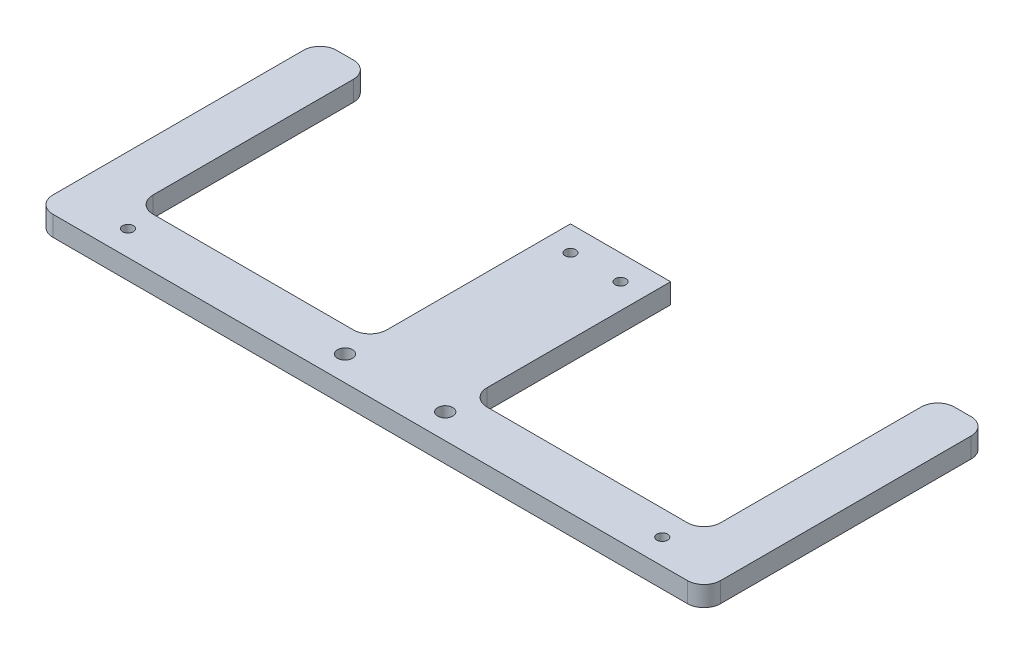
ISO-10303-21;
HEADER;
FILE_DESCRIPTION(('STEP AP214'),'2;1');
FILE_NAME('part.step','',(''),(''),'','','');
FILE_SCHEMA(('AUTOMOTIVE_DESIGN { 1 0 10303 214 1 1 1 1 }'));
ENDSEC;
DATA;
#1=APPLICATION_CONTEXT('core data for automotive mechanical design processes');
#2=APPLICATION_PROTOCOL_DEFINITION('international standard','automotive_design',2000,#1);
#3=PRODUCT_CONTEXT('',#1,'mechanical');
#4=PRODUCT('Part','Part','',(#3));
#5=PRODUCT_RELATED_PRODUCT_CATEGORY('part','',(#4));
#6=PRODUCT_DEFINITION_FORMATION('','',#4);
#7=PRODUCT_DEFINITION_CONTEXT('part definition',#1,'design');
#8=PRODUCT_DEFINITION('design','',#6,#7);
#9=PRODUCT_DEFINITION_SHAPE('','',#8);
#10=(LENGTH_UNIT() NAMED_UNIT(*) SI_UNIT(.MILLI.,.METRE.));
#11=(NAMED_UNIT(*) PLANE_ANGLE_UNIT() SI_UNIT($,.RADIAN.));
#12=(NAMED_UNIT(*) SI_UNIT($,.STERADIAN.) SOLID_ANGLE_UNIT());
#13=UNCERTAINTY_MEASURE_WITH_UNIT(LENGTH_MEASURE(1.E-05),#10,'distance_accuracy_value','');
#14=(GEOMETRIC_REPRESENTATION_CONTEXT(3) GLOBAL_UNCERTAINTY_ASSIGNED_CONTEXT((#13)) GLOBAL_UNIT_ASSIGNED_CONTEXT((#10,
#11,#12)) REPRESENTATION_CONTEXT('',''));
#15=CARTESIAN_POINT('',(0.,0.,0.));
#16=DIRECTION('',(0.,0.,1.));
#17=DIRECTION('',(1.,0.,0.));
#18=AXIS2_PLACEMENT_3D('',#15,#16,#17);
#19=CARTESIAN_POINT('',(-15.,6.,-60.));
#20=DIRECTION('',(0.,0.,1.));
#21=DIRECTION('',(1.,0.,0.));
#22=AXIS2_PLACEMENT_3D('',#19,#20,#21);
#23=PLANE('',#22);
#24=DIRECTION('',(-1.,0.,0.));
#25=VECTOR('',#24,1.);
#26=CARTESIAN_POINT('',(-15.,0.,-60.));
#27=LINE('',#26,#25);
#28=CARTESIAN_POINT('',(15.,0.,-60.));
#29=VERTEX_POINT('',#28);
#30=CARTESIAN_POINT('',(-15.,0.,-60.));
#31=VERTEX_POINT('',#30);
#32=EDGE_CURVE('E247',#29,#31,#27,.T.);
#33=ORIENTED_EDGE('',*,*,#32,.T.);
#34=DIRECTION('',(0.,-1.,0.));
#35=VECTOR('',#34,1.);
#36=CARTESIAN_POINT('',(-15.,6.,-60.));
#37=LINE('',#36,#35);
#38=CARTESIAN_POINT('',(-15.,6.,-60.));
#39=VERTEX_POINT('',#38);
#40=EDGE_CURVE('E188',#39,#31,#37,.T.);
#41=ORIENTED_EDGE('',*,*,#40,.F.);
#42=DIRECTION('',(-1.,0.,0.));
#43=VECTOR('',#42,1.);
#44=CARTESIAN_POINT('',(-15.,6.,-60.));
#45=LINE('',#44,#43);
#46=CARTESIAN_POINT('',(15.,6.,-60.));
#47=VERTEX_POINT('',#46);
#48=EDGE_CURVE('E183',#47,#39,#45,.T.);
#49=ORIENTED_EDGE('',*,*,#48,.F.);
#50=DIRECTION('',(0.,-1.,0.));
#51=VECTOR('',#50,1.);
#52=CARTESIAN_POINT('',(15.,6.,-60.));
#53=LINE('',#52,#51);
#54=EDGE_CURVE('E185',#47,#29,#53,.T.);
#55=ORIENTED_EDGE('',*,*,#54,.T.);
#56=EDGE_LOOP('',(#33,#41,#49,#55));
#57=FACE_BOUND('',#56,.T.);
#58=ADVANCED_FACE('F33',(#57),#23,.F.);
#59=CARTESIAN_POINT('',(-15.,6.,0.));
#60=DIRECTION('',(1.,0.,0.));
#61=DIRECTION('',(0.,0.,-1.));
#62=AXIS2_PLACEMENT_3D('',#59,#60,#61);
#63=PLANE('',#62);
#64=DIRECTION('',(0.,0.,1.));
#65=VECTOR('',#64,1.);
#66=CARTESIAN_POINT('',(-15.,0.,0.));
#67=LINE('',#66,#65);
#68=CARTESIAN_POINT('',(-15.,0.,-5.));
#69=VERTEX_POINT('',#68);
#70=EDGE_CURVE('E266',#31,#69,#67,.T.);
#71=ORIENTED_EDGE('',*,*,#70,.T.);
#72=DIRECTION('',(0.,-1.,0.));
#73=VECTOR('',#72,1.);
#74=CARTESIAN_POINT('',(-15.,6.,-5.));
#75=LINE('',#74,#73);
#76=CARTESIAN_POINT('',(-15.,6.,-5.));
#77=VERTEX_POINT('',#76);
#78=EDGE_CURVE('E289',#69,#77,#75,.F.);
#79=ORIENTED_EDGE('',*,*,#78,.T.);
#80=DIRECTION('',(0.,0.,1.));
#81=VECTOR('',#80,1.);
#82=CARTESIAN_POINT('',(-15.,6.,0.));
#83=LINE('',#82,#81);
#84=EDGE_CURVE('E192',#39,#77,#83,.T.);
#85=ORIENTED_EDGE('',*,*,#84,.F.);
#86=ORIENTED_EDGE('',*,*,#40,.T.);
#87=EDGE_LOOP('',(#71,#79,#85,#86));
#88=FACE_BOUND('',#87,.T.);
#89=ADVANCED_FACE('F386',(#88),#63,.F.);
#90=CARTESIAN_POINT('',(-85.,6.,0.));
#91=DIRECTION('',(0.,0.,1.));
#92=DIRECTION('',(1.,0.,0.));
#93=AXIS2_PLACEMENT_3D('',#90,#91,#92);
#94=PLANE('',#93);
#95=DIRECTION('',(-1.,0.,0.));
#96=VECTOR('',#95,1.);
#97=CARTESIAN_POINT('',(-85.,6.,0.));
#98=LINE('',#97,#96);
#99=CARTESIAN_POINT('',(-20.,6.,0.));
#100=VERTEX_POINT('',#99);
#101=CARTESIAN_POINT('',(-80.,6.,0.));
#102=VERTEX_POINT('',#101);
#103=EDGE_CURVE('E251',#100,#102,#98,.T.);
#104=ORIENTED_EDGE('',*,*,#103,.F.);
#105=DIRECTION('',(0.,-1.,0.));
#106=VECTOR('',#105,1.);
#107=CARTESIAN_POINT('',(-20.,0.,0.));
#108=LINE('',#107,#106);
#109=CARTESIAN_POINT('',(-20.,0.,0.));
#110=VERTEX_POINT('',#109);
#111=EDGE_CURVE('E286',#100,#110,#108,.T.);
#112=ORIENTED_EDGE('',*,*,#111,.T.);
#113=DIRECTION('',(-1.,0.,0.));
#114=VECTOR('',#113,1.);
#115=CARTESIAN_POINT('',(-85.,0.,0.));
#116=LINE('',#115,#114);
#117=CARTESIAN_POINT('',(-80.,0.,0.));
#118=VERTEX_POINT('',#117);
#119=EDGE_CURVE('E269',#110,#118,#116,.T.);
#120=ORIENTED_EDGE('',*,*,#119,.T.);
#121=DIRECTION('',(0.,-1.,0.));
#122=VECTOR('',#121,1.);
#123=CARTESIAN_POINT('',(-80.,6.,0.));
#124=LINE('',#123,#122);
#125=EDGE_CURVE('E284',#118,#102,#124,.F.);
#126=ORIENTED_EDGE('',*,*,#125,.T.);
#127=EDGE_LOOP('',(#104,#112,#120,#126));
#128=FACE_BOUND('',#127,.T.);
#129=ADVANCED_FACE('F395',(#128),#94,.F.);
#130=CARTESIAN_POINT('',(-85.,6.,0.));
#131=DIRECTION('',(-1.,0.,0.));
#132=DIRECTION('',(0.,0.,1.));
#133=AXIS2_PLACEMENT_3D('',#130,#131,#132);
#134=PLANE('',#133);
#135=DIRECTION('',(0.,0.,-1.));
#136=VECTOR('',#135,1.);
#137=CARTESIAN_POINT('',(-85.,6.,0.));
#138=LINE('',#137,#136);
#139=CARTESIAN_POINT('',(-85.,6.,-4.99999999999999));
#140=VERTEX_POINT('',#139);
#141=CARTESIAN_POINT('',(-85.,6.,-65.));
#142=VERTEX_POINT('',#141);
#143=EDGE_CURVE('E254',#140,#142,#138,.T.);
#144=ORIENTED_EDGE('',*,*,#143,.F.);
#145=DIRECTION('',(0.,-1.,0.));
#146=VECTOR('',#145,1.);
#147=CARTESIAN_POINT('',(-85.,0.,-4.99999999999999));
#148=LINE('',#147,#146);
#149=CARTESIAN_POINT('',(-85.,0.,-4.99999999999999));
#150=VERTEX_POINT('',#149);
#151=EDGE_CURVE('E293',#140,#150,#148,.T.);
#152=ORIENTED_EDGE('',*,*,#151,.T.);
#153=DIRECTION('',(0.,0.,-1.));
#154=VECTOR('',#153,1.);
#155=CARTESIAN_POINT('',(-85.,0.,0.));
#156=LINE('',#155,#154);
#157=CARTESIAN_POINT('',(-85.,0.,-65.));
#158=VERTEX_POINT('',#157);
#159=EDGE_CURVE('E272',#150,#158,#156,.T.);
#160=ORIENTED_EDGE('',*,*,#159,.T.);
#161=DIRECTION('',(0.,-1.,0.));
#162=VECTOR('',#161,1.);
#163=CARTESIAN_POINT('',(-85.,6.,-65.));
#164=LINE('',#163,#162);
#165=EDGE_CURVE('E291',#158,#142,#164,.F.);
#166=ORIENTED_EDGE('',*,*,#165,.T.);
#167=EDGE_LOOP('',(#144,#152,#160,#166));
#168=FACE_BOUND('',#167,.T.);
#169=ADVANCED_FACE('F404',(#168),#134,.F.);
#170=CARTESIAN_POINT('',(-85.,6.,-70.));
#171=DIRECTION('',(0.,0.,1.));
#172=DIRECTION('',(1.,0.,0.));
#173=AXIS2_PLACEMENT_3D('',#170,#171,#172);
#174=PLANE('',#173);
#175=DIRECTION('',(-1.,0.,0.));
#176=VECTOR('',#175,1.);
#177=CARTESIAN_POINT('',(-85.,0.,-70.));
#178=LINE('',#177,#176);
#179=CARTESIAN_POINT('',(-90.,0.,-70.));
#180=VERTEX_POINT('',#179);
#181=CARTESIAN_POINT('',(-95.,0.,-70.));
#182=VERTEX_POINT('',#181);
#183=EDGE_CURVE('E275',#180,#182,#178,.T.);
#184=ORIENTED_EDGE('',*,*,#183,.T.);
#185=DIRECTION('',(0.,-1.,0.));
#186=VECTOR('',#185,1.);
#187=CARTESIAN_POINT('',(-95.,6.,-70.));
#188=LINE('',#187,#186);
#189=CARTESIAN_POINT('',(-95.,6.,-70.));
#190=VERTEX_POINT('',#189);
#191=EDGE_CURVE('E319',#182,#190,#188,.F.);
#192=ORIENTED_EDGE('',*,*,#191,.T.);
#193=DIRECTION('',(-1.,0.,0.));
#194=VECTOR('',#193,1.);
#195=CARTESIAN_POINT('',(-85.,6.,-70.));
#196=LINE('',#195,#194);
#197=CARTESIAN_POINT('',(-90.,6.,-70.));
#198=VERTEX_POINT('',#197);
#199=EDGE_CURVE('E257',#198,#190,#196,.T.);
#200=ORIENTED_EDGE('',*,*,#199,.F.);
#201=DIRECTION('',(0.,-1.,0.));
#202=VECTOR('',#201,1.);
#203=CARTESIAN_POINT('',(-90.,6.,-70.));
#204=LINE('',#203,#202);
#205=EDGE_CURVE('E316',#198,#180,#204,.T.);
#206=ORIENTED_EDGE('',*,*,#205,.T.);
#207=EDGE_LOOP('',(#184,#192,#200,#206));
#208=FACE_BOUND('',#207,.T.);
#209=ADVANCED_FACE('F413',(#208),#174,.F.);
#210=CARTESIAN_POINT('',(-100.,6.,-70.));
#211=DIRECTION('',(1.,0.,0.));
#212=DIRECTION('',(0.,0.,-1.));
#213=AXIS2_PLACEMENT_3D('',#210,#211,#212);
#214=PLANE('',#213);
#215=DIRECTION('',(0.,0.,1.));
#216=VECTOR('',#215,1.);
#217=CARTESIAN_POINT('',(-100.,0.,-70.));
#218=LINE('',#217,#216);
#219=CARTESIAN_POINT('',(-100.,0.,-65.));
#220=VERTEX_POINT('',#219);
#221=CARTESIAN_POINT('',(-100.,0.,9.99999999999999));
#222=VERTEX_POINT('',#221);
#223=EDGE_CURVE('E278',#220,#222,#218,.T.);
#224=ORIENTED_EDGE('',*,*,#223,.T.);
#225=DIRECTION('',(0.,-1.,0.));
#226=VECTOR('',#225,1.);
#227=CARTESIAN_POINT('',(-100.,6.,9.99999999999999));
#228=LINE('',#227,#226);
#229=CARTESIAN_POINT('',(-100.,6.,9.99999999999999));
#230=VERTEX_POINT('',#229);
#231=EDGE_CURVE('E308',#222,#230,#228,.F.);
#232=ORIENTED_EDGE('',*,*,#231,.T.);
#233=DIRECTION('',(0.,0.,1.));
#234=VECTOR('',#233,1.);
#235=CARTESIAN_POINT('',(-100.,6.,-70.));
#236=LINE('',#235,#234);
#237=CARTESIAN_POINT('',(-100.,6.,-65.));
#238=VERTEX_POINT('',#237);
#239=EDGE_CURVE('E260',#238,#230,#236,.T.);
#240=ORIENTED_EDGE('',*,*,#239,.F.);
#241=DIRECTION('',(0.,-1.,0.));
#242=VECTOR('',#241,1.);
#243=CARTESIAN_POINT('',(-100.,6.,-65.));
#244=LINE('',#243,#242);
#245=EDGE_CURVE('E305',#238,#220,#244,.T.);
#246=ORIENTED_EDGE('',*,*,#245,.T.);
#247=EDGE_LOOP('',(#224,#232,#240,#246));
#248=FACE_BOUND('',#247,.T.);
#249=ADVANCED_FACE('F422',(#248),#214,.F.);
#250=CARTESIAN_POINT('',(-100.,6.,15.));
#251=DIRECTION('',(0.,0.,-1.));
#252=DIRECTION('',(-1.,0.,0.));
#253=AXIS2_PLACEMENT_3D('',#250,#251,#252);
#254=PLANE('',#253);
#255=DIRECTION('',(1.,0.,0.));
#256=VECTOR('',#255,1.);
#257=CARTESIAN_POINT('',(-100.,0.,15.));
#258=LINE('',#257,#256);
#259=CARTESIAN_POINT('',(-95.,0.,15.));
#260=VERTEX_POINT('',#259);
#261=CARTESIAN_POINT('',(95.,0.,15.));
#262=VERTEX_POINT('',#261);
#263=EDGE_CURVE('E193',#260,#262,#258,.T.);
#264=ORIENTED_EDGE('',*,*,#263,.T.);
#265=DIRECTION('',(0.,-1.,0.));
#266=VECTOR('',#265,1.);
#267=CARTESIAN_POINT('',(95.,6.,15.));
#268=LINE('',#267,#266);
#269=CARTESIAN_POINT('',(95.,6.,15.));
#270=VERTEX_POINT('',#269);
#271=EDGE_CURVE('E352',#262,#270,#268,.F.);
#272=ORIENTED_EDGE('',*,*,#271,.T.);
#273=DIRECTION('',(1.,0.,0.));
#274=VECTOR('',#273,1.);
#275=CARTESIAN_POINT('',(-100.,6.,15.));
#276=LINE('',#275,#274);
#277=CARTESIAN_POINT('',(-95.,6.,15.));
#278=VERTEX_POINT('',#277);
#279=EDGE_CURVE('E263',#278,#270,#276,.T.);
#280=ORIENTED_EDGE('',*,*,#279,.F.);
#281=DIRECTION('',(0.,-1.,0.));
#282=VECTOR('',#281,1.);
#283=CARTESIAN_POINT('',(-95.,6.,15.));
#284=LINE('',#283,#282);
#285=EDGE_CURVE('E296',#278,#260,#284,.T.);
#286=ORIENTED_EDGE('',*,*,#285,.T.);
#287=EDGE_LOOP('',(#264,#272,#280,#286));
#288=FACE_BOUND('',#287,.T.);
#289=ADVANCED_FACE('F431',(#288),#254,.F.);
#290=CARTESIAN_POINT('',(0.,6.,0.));
#291=DIRECTION('',(0.,1.,0.));
#292=DIRECTION('',(0.,0.,1.));
#293=AXIS2_PLACEMENT_3D('',#290,#291,#292);
#294=PLANE('',#293);
#295=CARTESIAN_POINT('',(7.5,6.,-52.5));
#296=DIRECTION('',(0.,-1.,0.));
#297=DIRECTION('',(0.,0.,1.));
#298=AXIS2_PLACEMENT_3D('',#295,#296,#297);
#299=CIRCLE('',#298,1.6);
#300=CARTESIAN_POINT('',(7.5,6.,-50.9));
#301=VERTEX_POINT('',#300);
#302=EDGE_CURVE('E746',#301,#301,#299,.T.);
#303=ORIENTED_EDGE('',*,*,#302,.T.);
#304=EDGE_LOOP('',(#303));
#305=FACE_BOUND('',#304,.T.);
#306=CARTESIAN_POINT('',(80.,6.,7.5));
#307=DIRECTION('',(0.,-1.,0.));
#308=DIRECTION('',(0.,0.,1.));
#309=AXIS2_PLACEMENT_3D('',#306,#307,#308);
#310=CIRCLE('',#309,1.60000000000001);
#311=CARTESIAN_POINT('',(80.,6.,9.1));
#312=VERTEX_POINT('',#311);
#313=EDGE_CURVE('E750',#312,#312,#310,.T.);
#314=ORIENTED_EDGE('',*,*,#313,.T.);
#315=EDGE_LOOP('',(#314));
#316=FACE_BOUND('',#315,.T.);
#317=CARTESIAN_POINT('',(15.,6.,7.5));
#318=DIRECTION('',(0.,-1.,0.));
#319=DIRECTION('',(0.,0.,1.));
#320=AXIS2_PLACEMENT_3D('',#317,#318,#319);
#321=CIRCLE('',#320,2.25);
#322=CARTESIAN_POINT('',(15.,6.,9.74999999999999));
#323=VERTEX_POINT('',#322);
#324=EDGE_CURVE('E446',#323,#323,#321,.T.);
#325=ORIENTED_EDGE('',*,*,#324,.T.);
#326=EDGE_LOOP('',(#325));
#327=FACE_BOUND('',#326,.T.);
#328=CARTESIAN_POINT('',(-7.5,6.,-52.5));
#329=DIRECTION('',(0.,1.,0.));
#330=DIRECTION('',(0.,0.,1.));
#331=AXIS2_PLACEMENT_3D('',#328,#329,#330);
#332=CIRCLE('',#331,1.6);
#333=CARTESIAN_POINT('',(-7.5,6.,-50.9));
#334=VERTEX_POINT('',#333);
#335=EDGE_CURVE('E203',#334,#334,#332,.T.);
#336=ORIENTED_EDGE('',*,*,#335,.F.);
#337=EDGE_LOOP('',(#336));
#338=FACE_BOUND('',#337,.T.);
#339=CARTESIAN_POINT('',(-80.,6.,7.5));
#340=DIRECTION('',(0.,1.,0.));
#341=DIRECTION('',(0.,0.,1.));
#342=AXIS2_PLACEMENT_3D('',#339,#340,#341);
#343=CIRCLE('',#342,1.60000000000001);
#344=CARTESIAN_POINT('',(-80.,6.,9.1));
#345=VERTEX_POINT('',#344);
#346=EDGE_CURVE('E236',#345,#345,#343,.T.);
#347=ORIENTED_EDGE('',*,*,#346,.F.);
#348=EDGE_LOOP('',(#347));
#349=FACE_BOUND('',#348,.T.);
#350=CARTESIAN_POINT('',(-15.,6.,7.5));
#351=DIRECTION('',(0.,1.,0.));
#352=DIRECTION('',(0.,0.,1.));
#353=AXIS2_PLACEMENT_3D('',#350,#351,#352);
#354=CIRCLE('',#353,2.25);
#355=CARTESIAN_POINT('',(-15.,6.,9.74999999999999));
#356=VERTEX_POINT('',#355);
#357=EDGE_CURVE('E235',#356,#356,#354,.T.);
#358=ORIENTED_EDGE('',*,*,#357,.F.);
#359=EDGE_LOOP('',(#358));
#360=FACE_BOUND('',#359,.T.);
#361=ORIENTED_EDGE('',*,*,#279,.T.);
#362=CARTESIAN_POINT('',(95.,6.,9.99999999999999));
#363=DIRECTION('',(0.,1.,0.));
#364=DIRECTION('',(0.,0.,1.));
#365=AXIS2_PLACEMENT_3D('',#362,#363,#364);
#366=CIRCLE('',#365,5.);
#367=CARTESIAN_POINT('',(100.,6.,9.99999999999999));
#368=VERTEX_POINT('',#367);
#369=EDGE_CURVE('E357',#270,#368,#366,.T.);
#370=ORIENTED_EDGE('',*,*,#369,.T.);
#371=DIRECTION('',(0.,0.,1.));
#372=VECTOR('',#371,1.);
#373=CARTESIAN_POINT('',(100.,6.,-70.));
#374=LINE('',#373,#372);
#375=CARTESIAN_POINT('',(100.,6.,-65.));
#376=VERTEX_POINT('',#375);
#377=EDGE_CURVE('E230',#376,#368,#374,.T.);
#378=ORIENTED_EDGE('',*,*,#377,.F.);
#379=CARTESIAN_POINT('',(95.,6.,-65.));
#380=DIRECTION('',(0.,1.,0.));
#381=DIRECTION('',(0.,0.,1.));
#382=AXIS2_PLACEMENT_3D('',#379,#380,#381);
#383=CIRCLE('',#382,5.);
#384=CARTESIAN_POINT('',(95.,6.,-70.));
#385=VERTEX_POINT('',#384);
#386=EDGE_CURVE('E48',#376,#385,#383,.T.);
#387=ORIENTED_EDGE('',*,*,#386,.T.);
#388=DIRECTION('',(1.,0.,0.));
#389=VECTOR('',#388,1.);
#390=CARTESIAN_POINT('',(85.,6.,-70.));
#391=LINE('',#390,#389);
#392=CARTESIAN_POINT('',(90.,6.,-70.));
#393=VERTEX_POINT('',#392);
#394=EDGE_CURVE('E442',#393,#385,#391,.T.);
#395=ORIENTED_EDGE('',*,*,#394,.F.);
#396=CARTESIAN_POINT('',(90.,6.,-65.));
#397=DIRECTION('',(0.,1.,0.));
#398=DIRECTION('',(0.,0.,1.));
#399=AXIS2_PLACEMENT_3D('',#396,#397,#398);
#400=CIRCLE('',#399,5.);
#401=CARTESIAN_POINT('',(85.,6.,-65.));
#402=VERTEX_POINT('',#401);
#403=EDGE_CURVE('E354',#393,#402,#400,.T.);
#404=ORIENTED_EDGE('',*,*,#403,.T.);
#405=DIRECTION('',(0.,0.,-1.));
#406=VECTOR('',#405,1.);
#407=CARTESIAN_POINT('',(85.,6.,0.));
#408=LINE('',#407,#406);
#409=CARTESIAN_POINT('',(85.,6.,-4.99999999999999));
#410=VERTEX_POINT('',#409);
#411=EDGE_CURVE('E213',#410,#402,#408,.T.);
#412=ORIENTED_EDGE('',*,*,#411,.F.);
#413=CARTESIAN_POINT('',(80.,6.,-4.99999999999999));
#414=DIRECTION('',(0.,1.,0.));
#415=DIRECTION('',(0.,0.,1.));
#416=AXIS2_PLACEMENT_3D('',#413,#414,#415);
#417=CIRCLE('',#416,5.);
#418=CARTESIAN_POINT('',(80.,6.,0.));
#419=VERTEX_POINT('',#418);
#420=EDGE_CURVE('E11',#410,#419,#417,.F.);
#421=ORIENTED_EDGE('',*,*,#420,.T.);
#422=DIRECTION('',(1.,0.,0.));
#423=VECTOR('',#422,1.);
#424=CARTESIAN_POINT('',(85.,6.,0.));
#425=LINE('',#424,#423);
#426=CARTESIAN_POINT('',(20.,6.,0.));
#427=VERTEX_POINT('',#426);
#428=EDGE_CURVE('E210',#427,#419,#425,.T.);
#429=ORIENTED_EDGE('',*,*,#428,.F.);
#430=CARTESIAN_POINT('',(20.,6.,-5.));
#431=DIRECTION('',(0.,1.,0.));
#432=DIRECTION('',(0.,0.,1.));
#433=AXIS2_PLACEMENT_3D('',#430,#431,#432);
#434=CIRCLE('',#433,5.);
#435=CARTESIAN_POINT('',(15.,6.,-5.));
#436=VERTEX_POINT('',#435);
#437=EDGE_CURVE('E209',#427,#436,#434,.F.);
#438=ORIENTED_EDGE('',*,*,#437,.T.);
#439=DIRECTION('',(0.,0.,1.));
#440=VECTOR('',#439,1.);
#441=CARTESIAN_POINT('',(15.,6.,0.));
#442=LINE('',#441,#440);
#443=EDGE_CURVE('E199',#47,#436,#442,.T.);
#444=ORIENTED_EDGE('',*,*,#443,.F.);
#445=ORIENTED_EDGE('',*,*,#48,.T.);
#446=ORIENTED_EDGE('',*,*,#84,.T.);
#447=CARTESIAN_POINT('',(-20.,6.,-5.));
#448=DIRECTION('',(0.,1.,0.));
#449=DIRECTION('',(0.,0.,1.));
#450=AXIS2_PLACEMENT_3D('',#447,#448,#449);
#451=CIRCLE('',#450,5.);
#452=EDGE_CURVE('E323',#77,#100,#451,.F.);
#453=ORIENTED_EDGE('',*,*,#452,.T.);
#454=ORIENTED_EDGE('',*,*,#103,.T.);
#455=CARTESIAN_POINT('',(-80.,6.,-4.99999999999999));
#456=DIRECTION('',(0.,1.,0.));
#457=DIRECTION('',(0.,0.,1.));
#458=AXIS2_PLACEMENT_3D('',#455,#456,#457);
#459=CIRCLE('',#458,5.);
#460=EDGE_CURVE('E327',#102,#140,#459,.F.);
#461=ORIENTED_EDGE('',*,*,#460,.T.);
#462=ORIENTED_EDGE('',*,*,#143,.T.);
#463=CARTESIAN_POINT('',(-90.,6.,-65.));
#464=DIRECTION('',(0.,1.,0.));
#465=DIRECTION('',(0.,0.,1.));
#466=AXIS2_PLACEMENT_3D('',#463,#464,#465);
#467=CIRCLE('',#466,5.);
#468=EDGE_CURVE('E310',#142,#198,#467,.T.);
#469=ORIENTED_EDGE('',*,*,#468,.T.);
#470=ORIENTED_EDGE('',*,*,#199,.T.);
#471=CARTESIAN_POINT('',(-95.,6.,-65.));
#472=DIRECTION('',(0.,1.,0.));
#473=DIRECTION('',(0.,0.,1.));
#474=AXIS2_PLACEMENT_3D('',#471,#472,#473);
#475=CIRCLE('',#474,5.);
#476=EDGE_CURVE('E312',#190,#238,#475,.T.);
#477=ORIENTED_EDGE('',*,*,#476,.T.);
#478=ORIENTED_EDGE('',*,*,#239,.T.);
#479=CARTESIAN_POINT('',(-95.,6.,10.));
#480=DIRECTION('',(0.,1.,0.));
#481=DIRECTION('',(0.,0.,1.));
#482=AXIS2_PLACEMENT_3D('',#479,#480,#481);
#483=CIRCLE('',#482,5.);
#484=EDGE_CURVE('E314',#230,#278,#483,.T.);
#485=ORIENTED_EDGE('',*,*,#484,.T.);
#486=EDGE_LOOP('',(#361,#370,#378,#387,#395,#404,#412,#421,#429,#438,#444,#445,#446,#453,#454,
#461,#462,#469,#470,#477,#478,#485));
#487=FACE_BOUND('',#486,.T.);
#488=ADVANCED_FACE('F206',(#305,#316,#327,#338,#349,#360,#487),#294,.T.);
#489=CARTESIAN_POINT('',(0.,0.,0.));
#490=DIRECTION('',(0.,1.,0.));
#491=DIRECTION('',(0.,0.,1.));
#492=AXIS2_PLACEMENT_3D('',#489,#490,#491);
#493=PLANE('',#492);
#494=CARTESIAN_POINT('',(7.5,0.,-52.5));
#495=DIRECTION('',(0.,-1.,0.));
#496=DIRECTION('',(0.,0.,1.));
#497=AXIS2_PLACEMENT_3D('',#494,#495,#496);
#498=CIRCLE('',#497,1.6);
#499=CARTESIAN_POINT('',(7.5,0.,-50.9));
#500=VERTEX_POINT('',#499);
#501=EDGE_CURVE('E722',#500,#500,#498,.T.);
#502=ORIENTED_EDGE('',*,*,#501,.F.);
#503=EDGE_LOOP('',(#502));
#504=FACE_BOUND('',#503,.T.);
#505=CARTESIAN_POINT('',(80.,0.,7.5));
#506=DIRECTION('',(0.,-1.,0.));
#507=DIRECTION('',(0.,0.,1.));
#508=AXIS2_PLACEMENT_3D('',#505,#506,#507);
#509=CIRCLE('',#508,1.60000000000001);
#510=CARTESIAN_POINT('',(80.,0.,9.1));
#511=VERTEX_POINT('',#510);
#512=EDGE_CURVE('E726',#511,#511,#509,.T.);
#513=ORIENTED_EDGE('',*,*,#512,.F.);
#514=EDGE_LOOP('',(#513));
#515=FACE_BOUND('',#514,.T.);
#516=CARTESIAN_POINT('',(15.,0.,7.5));
#517=DIRECTION('',(0.,-1.,0.));
#518=DIRECTION('',(0.,0.,1.));
#519=AXIS2_PLACEMENT_3D('',#516,#517,#518);
#520=CIRCLE('',#519,2.25);
#521=CARTESIAN_POINT('',(15.,0.,9.74999999999999));
#522=VERTEX_POINT('',#521);
#523=EDGE_CURVE('E221',#522,#522,#520,.T.);
#524=ORIENTED_EDGE('',*,*,#523,.F.);
#525=EDGE_LOOP('',(#524));
#526=FACE_BOUND('',#525,.T.);
#527=CARTESIAN_POINT('',(-7.5,0.,-52.5));
#528=DIRECTION('',(0.,1.,0.));
#529=DIRECTION('',(0.,0.,1.));
#530=AXIS2_PLACEMENT_3D('',#527,#528,#529);
#531=CIRCLE('',#530,1.6);
#532=CARTESIAN_POINT('',(-7.5,0.,-50.9));
#533=VERTEX_POINT('',#532);
#534=EDGE_CURVE('E239',#533,#533,#531,.T.);
#535=ORIENTED_EDGE('',*,*,#534,.T.);
#536=EDGE_LOOP('',(#535));
#537=FACE_BOUND('',#536,.T.);
#538=CARTESIAN_POINT('',(-80.,0.,7.5));
#539=DIRECTION('',(0.,1.,0.));
#540=DIRECTION('',(0.,0.,1.));
#541=AXIS2_PLACEMENT_3D('',#538,#539,#540);
#542=CIRCLE('',#541,1.60000000000001);
#543=CARTESIAN_POINT('',(-80.,0.,9.1));
#544=VERTEX_POINT('',#543);
#545=EDGE_CURVE('E232',#544,#544,#542,.T.);
#546=ORIENTED_EDGE('',*,*,#545,.T.);
#547=EDGE_LOOP('',(#546));
#548=FACE_BOUND('',#547,.T.);
#549=CARTESIAN_POINT('',(-15.,0.,7.5));
#550=DIRECTION('',(0.,1.,0.));
#551=DIRECTION('',(0.,0.,1.));
#552=AXIS2_PLACEMENT_3D('',#549,#550,#551);
#553=CIRCLE('',#552,2.25);
#554=CARTESIAN_POINT('',(-15.,0.,9.74999999999999));
#555=VERTEX_POINT('',#554);
#556=EDGE_CURVE('E244',#555,#555,#553,.T.);
#557=ORIENTED_EDGE('',*,*,#556,.T.);
#558=EDGE_LOOP('',(#557));
#559=FACE_BOUND('',#558,.T.);
#560=DIRECTION('',(0.,0.,1.));
#561=VECTOR('',#560,1.);
#562=CARTESIAN_POINT('',(100.,0.,-70.));
#563=LINE('',#562,#561);
#564=CARTESIAN_POINT('',(100.,0.,-65.));
#565=VERTEX_POINT('',#564);
#566=CARTESIAN_POINT('',(100.,0.,9.99999999999999));
#567=VERTEX_POINT('',#566);
#568=EDGE_CURVE('E217',#565,#567,#563,.T.);
#569=ORIENTED_EDGE('',*,*,#568,.T.);
#570=CARTESIAN_POINT('',(95.,0.,9.99999999999999));
#571=DIRECTION('',(0.,1.,0.));
#572=DIRECTION('',(0.,0.,1.));
#573=AXIS2_PLACEMENT_3D('',#570,#571,#572);
#574=CIRCLE('',#573,5.);
#575=EDGE_CURVE('E350',#567,#262,#574,.F.);
#576=ORIENTED_EDGE('',*,*,#575,.T.);
#577=ORIENTED_EDGE('',*,*,#263,.F.);
#578=CARTESIAN_POINT('',(-95.,0.,10.));
#579=DIRECTION('',(0.,1.,0.));
#580=DIRECTION('',(0.,0.,1.));
#581=AXIS2_PLACEMENT_3D('',#578,#579,#580);
#582=CIRCLE('',#581,5.);
#583=EDGE_CURVE('E303',#260,#222,#582,.F.);
#584=ORIENTED_EDGE('',*,*,#583,.T.);
#585=ORIENTED_EDGE('',*,*,#223,.F.);
#586=CARTESIAN_POINT('',(-95.,0.,-65.));
#587=DIRECTION('',(0.,1.,0.));
#588=DIRECTION('',(0.,0.,1.));
#589=AXIS2_PLACEMENT_3D('',#586,#587,#588);
#590=CIRCLE('',#589,5.);
#591=EDGE_CURVE('E301',#220,#182,#590,.F.);
#592=ORIENTED_EDGE('',*,*,#591,.T.);
#593=ORIENTED_EDGE('',*,*,#183,.F.);
#594=CARTESIAN_POINT('',(-90.,0.,-65.));
#595=DIRECTION('',(0.,1.,0.));
#596=DIRECTION('',(0.,0.,1.));
#597=AXIS2_PLACEMENT_3D('',#594,#595,#596);
#598=CIRCLE('',#597,5.);
#599=EDGE_CURVE('E299',#180,#158,#598,.F.);
#600=ORIENTED_EDGE('',*,*,#599,.T.);
#601=ORIENTED_EDGE('',*,*,#159,.F.);
#602=CARTESIAN_POINT('',(-80.,0.,-4.99999999999999));
#603=DIRECTION('',(0.,1.,0.));
#604=DIRECTION('',(0.,0.,1.));
#605=AXIS2_PLACEMENT_3D('',#602,#603,#604);
#606=CIRCLE('',#605,5.);
#607=EDGE_CURVE('E325',#150,#118,#606,.T.);
#608=ORIENTED_EDGE('',*,*,#607,.T.);
#609=ORIENTED_EDGE('',*,*,#119,.F.);
#610=CARTESIAN_POINT('',(-20.,0.,-5.));
#611=DIRECTION('',(0.,1.,0.));
#612=DIRECTION('',(0.,0.,1.));
#613=AXIS2_PLACEMENT_3D('',#610,#611,#612);
#614=CIRCLE('',#613,5.);
#615=EDGE_CURVE('E321',#110,#69,#614,.T.);
#616=ORIENTED_EDGE('',*,*,#615,.T.);
#617=ORIENTED_EDGE('',*,*,#70,.F.);
#618=ORIENTED_EDGE('',*,*,#32,.F.);
#619=DIRECTION('',(0.,0.,1.));
#620=VECTOR('',#619,1.);
#621=CARTESIAN_POINT('',(15.,0.,0.));
#622=LINE('',#621,#620);
#623=CARTESIAN_POINT('',(15.,0.,-5.));
#624=VERTEX_POINT('',#623);
#625=EDGE_CURVE('E202',#29,#624,#622,.T.);
#626=ORIENTED_EDGE('',*,*,#625,.T.);
#627=CARTESIAN_POINT('',(20.,0.,-5.));
#628=DIRECTION('',(0.,1.,0.));
#629=DIRECTION('',(0.,0.,1.));
#630=AXIS2_PLACEMENT_3D('',#627,#628,#629);
#631=CIRCLE('',#630,5.);
#632=CARTESIAN_POINT('',(20.,0.,0.));
#633=VERTEX_POINT('',#632);
#634=EDGE_CURVE('E363',#624,#633,#631,.T.);
#635=ORIENTED_EDGE('',*,*,#634,.T.);
#636=DIRECTION('',(1.,0.,0.));
#637=VECTOR('',#636,1.);
#638=CARTESIAN_POINT('',(85.,0.,0.));
#639=LINE('',#638,#637);
#640=CARTESIAN_POINT('',(80.,0.,0.));
#641=VERTEX_POINT('',#640);
#642=EDGE_CURVE('E227',#633,#641,#639,.T.);
#643=ORIENTED_EDGE('',*,*,#642,.T.);
#644=CARTESIAN_POINT('',(80.,0.,-4.99999999999999));
#645=DIRECTION('',(0.,1.,0.));
#646=DIRECTION('',(0.,0.,1.));
#647=AXIS2_PLACEMENT_3D('',#644,#645,#646);
#648=CIRCLE('',#647,5.);
#649=CARTESIAN_POINT('',(85.,0.,-4.99999999999999));
#650=VERTEX_POINT('',#649);
#651=EDGE_CURVE('E41',#641,#650,#648,.T.);
#652=ORIENTED_EDGE('',*,*,#651,.T.);
#653=DIRECTION('',(0.,0.,-1.));
#654=VECTOR('',#653,1.);
#655=CARTESIAN_POINT('',(85.,0.,0.));
#656=LINE('',#655,#654);
#657=CARTESIAN_POINT('',(85.,0.,-65.));
#658=VERTEX_POINT('',#657);
#659=EDGE_CURVE('E224',#650,#658,#656,.T.);
#660=ORIENTED_EDGE('',*,*,#659,.T.);
#661=CARTESIAN_POINT('',(90.,0.,-65.));
#662=DIRECTION('',(0.,1.,0.));
#663=DIRECTION('',(0.,0.,1.));
#664=AXIS2_PLACEMENT_3D('',#661,#662,#663);
#665=CIRCLE('',#664,5.);
#666=CARTESIAN_POINT('',(90.,0.,-70.));
#667=VERTEX_POINT('',#666);
#668=EDGE_CURVE('E346',#658,#667,#665,.F.);
#669=ORIENTED_EDGE('',*,*,#668,.T.);
#670=DIRECTION('',(1.,0.,0.));
#671=VECTOR('',#670,1.);
#672=CARTESIAN_POINT('',(85.,0.,-70.));
#673=LINE('',#672,#671);
#674=CARTESIAN_POINT('',(95.,0.,-70.));
#675=VERTEX_POINT('',#674);
#676=EDGE_CURVE('E220',#667,#675,#673,.T.);
#677=ORIENTED_EDGE('',*,*,#676,.T.);
#678=CARTESIAN_POINT('',(95.,0.,-65.));
#679=DIRECTION('',(0.,1.,0.));
#680=DIRECTION('',(0.,0.,1.));
#681=AXIS2_PLACEMENT_3D('',#678,#679,#680);
#682=CIRCLE('',#681,5.);
#683=EDGE_CURVE('E348',#675,#565,#682,.F.);
#684=ORIENTED_EDGE('',*,*,#683,.T.);
#685=EDGE_LOOP('',(#569,#576,#577,#584,#585,#592,#593,#600,#601,#608,#609,#616,#617,#618,#626,
#635,#643,#652,#660,#669,#677,#684));
#686=FACE_BOUND('',#685,.T.);
#687=ADVANCED_FACE('F367',(#504,#515,#526,#537,#548,#559,#686),#493,.F.);
#688=CARTESIAN_POINT('',(-20.,6.,-5.));
#689=DIRECTION('',(0.,1.,0.));
#690=DIRECTION('',(0.,0.,1.));
#691=AXIS2_PLACEMENT_3D('',#688,#689,#690);
#692=CYLINDRICAL_SURFACE('',#691,5.);
#693=ORIENTED_EDGE('',*,*,#452,.F.);
#694=ORIENTED_EDGE('',*,*,#78,.F.);
#695=ORIENTED_EDGE('',*,*,#615,.F.);
#696=ORIENTED_EDGE('',*,*,#111,.F.);
#697=EDGE_LOOP('',(#693,#694,#695,#696));
#698=FACE_BOUND('',#697,.T.);
#699=ADVANCED_FACE('F392',(#698),#692,.F.);
#700=CARTESIAN_POINT('',(-80.,6.,-4.99999999999999));
#701=DIRECTION('',(0.,1.,0.));
#702=DIRECTION('',(0.,0.,1.));
#703=AXIS2_PLACEMENT_3D('',#700,#701,#702);
#704=CYLINDRICAL_SURFACE('',#703,5.);
#705=ORIENTED_EDGE('',*,*,#460,.F.);
#706=ORIENTED_EDGE('',*,*,#125,.F.);
#707=ORIENTED_EDGE('',*,*,#607,.F.);
#708=ORIENTED_EDGE('',*,*,#151,.F.);
#709=EDGE_LOOP('',(#705,#706,#707,#708));
#710=FACE_BOUND('',#709,.T.);
#711=ADVANCED_FACE('F401',(#710),#704,.F.);
#712=CARTESIAN_POINT('',(-95.,6.,10.));
#713=DIRECTION('',(0.,-1.,0.));
#714=DIRECTION('',(0.,0.,-1.));
#715=AXIS2_PLACEMENT_3D('',#712,#713,#714);
#716=CYLINDRICAL_SURFACE('',#715,5.);
#717=ORIENTED_EDGE('',*,*,#484,.F.);
#718=ORIENTED_EDGE('',*,*,#231,.F.);
#719=ORIENTED_EDGE('',*,*,#583,.F.);
#720=ORIENTED_EDGE('',*,*,#285,.F.);
#721=EDGE_LOOP('',(#717,#718,#719,#720));
#722=FACE_BOUND('',#721,.T.);
#723=ADVANCED_FACE('F428',(#722),#716,.T.);
#724=CARTESIAN_POINT('',(-95.,6.,-65.));
#725=DIRECTION('',(0.,-1.,0.));
#726=DIRECTION('',(0.,0.,-1.));
#727=AXIS2_PLACEMENT_3D('',#724,#725,#726);
#728=CYLINDRICAL_SURFACE('',#727,5.);
#729=ORIENTED_EDGE('',*,*,#476,.F.);
#730=ORIENTED_EDGE('',*,*,#191,.F.);
#731=ORIENTED_EDGE('',*,*,#591,.F.);
#732=ORIENTED_EDGE('',*,*,#245,.F.);
#733=EDGE_LOOP('',(#729,#730,#731,#732));
#734=FACE_BOUND('',#733,.T.);
#735=ADVANCED_FACE('F419',(#734),#728,.T.);
#736=CARTESIAN_POINT('',(-90.,6.,-65.));
#737=DIRECTION('',(0.,-1.,0.));
#738=DIRECTION('',(0.,0.,-1.));
#739=AXIS2_PLACEMENT_3D('',#736,#737,#738);
#740=CYLINDRICAL_SURFACE('',#739,5.);
#741=ORIENTED_EDGE('',*,*,#468,.F.);
#742=ORIENTED_EDGE('',*,*,#165,.F.);
#743=ORIENTED_EDGE('',*,*,#599,.F.);
#744=ORIENTED_EDGE('',*,*,#205,.F.);
#745=EDGE_LOOP('',(#741,#742,#743,#744));
#746=FACE_BOUND('',#745,.T.);
#747=ADVANCED_FACE('F410',(#746),#740,.T.);
#748=CARTESIAN_POINT('',(-15.,0.,7.5));
#749=DIRECTION('',(0.,1.,0.));
#750=DIRECTION('',(0.,0.,1.));
#751=AXIS2_PLACEMENT_3D('',#748,#749,#750);
#752=CYLINDRICAL_SURFACE('',#751,2.25);
#753=ORIENTED_EDGE('',*,*,#556,.F.);
#754=EDGE_LOOP('',(#753));
#755=FACE_BOUND('',#754,.T.);
#756=ORIENTED_EDGE('',*,*,#357,.T.);
#757=EDGE_LOOP('',(#756));
#758=FACE_BOUND('',#757,.T.);
#759=ADVANCED_FACE('F480',(#755,#758),#752,.F.);
#760=CARTESIAN_POINT('',(-80.,0.,7.5));
#761=DIRECTION('',(0.,1.,0.));
#762=DIRECTION('',(0.,0.,1.));
#763=AXIS2_PLACEMENT_3D('',#760,#761,#762);
#764=CYLINDRICAL_SURFACE('',#763,1.60000000000001);
#765=ORIENTED_EDGE('',*,*,#545,.F.);
#766=EDGE_LOOP('',(#765));
#767=FACE_BOUND('',#766,.T.);
#768=ORIENTED_EDGE('',*,*,#346,.T.);
#769=EDGE_LOOP('',(#768));
#770=FACE_BOUND('',#769,.T.);
#771=ADVANCED_FACE('F549',(#767,#770),#764,.F.);
#772=CARTESIAN_POINT('',(-7.5,0.,-52.5));
#773=DIRECTION('',(0.,1.,0.));
#774=DIRECTION('',(0.,0.,1.));
#775=AXIS2_PLACEMENT_3D('',#772,#773,#774);
#776=CYLINDRICAL_SURFACE('',#775,1.6);
#777=ORIENTED_EDGE('',*,*,#534,.F.);
#778=EDGE_LOOP('',(#777));
#779=FACE_BOUND('',#778,.T.);
#780=ORIENTED_EDGE('',*,*,#335,.T.);
#781=EDGE_LOOP('',(#780));
#782=FACE_BOUND('',#781,.T.);
#783=ADVANCED_FACE('F548',(#779,#782),#776,.F.);
#784=CARTESIAN_POINT('',(100.,6.,-70.));
#785=DIRECTION('',(1.,0.,0.));
#786=DIRECTION('',(0.,0.,-1.));
#787=AXIS2_PLACEMENT_3D('',#784,#785,#786);
#788=PLANE('',#787);
#789=ORIENTED_EDGE('',*,*,#377,.T.);
#790=DIRECTION('',(0.,-1.,0.));
#791=VECTOR('',#790,1.);
#792=CARTESIAN_POINT('',(100.,0.,9.99999999999999));
#793=LINE('',#792,#791);
#794=EDGE_CURVE('E343',#368,#567,#793,.T.);
#795=ORIENTED_EDGE('',*,*,#794,.T.);
#796=ORIENTED_EDGE('',*,*,#568,.F.);
#797=DIRECTION('',(0.,-1.,0.));
#798=VECTOR('',#797,1.);
#799=CARTESIAN_POINT('',(100.,6.,-65.));
#800=LINE('',#799,#798);
#801=EDGE_CURVE('E341',#565,#376,#800,.F.);
#802=ORIENTED_EDGE('',*,*,#801,.T.);
#803=EDGE_LOOP('',(#789,#795,#796,#802));
#804=FACE_BOUND('',#803,.T.);
#805=ADVANCED_FACE('F440',(#804),#788,.T.);
#806=CARTESIAN_POINT('',(85.,6.,-70.));
#807=DIRECTION('',(0.,0.,-1.));
#808=DIRECTION('',(-1.,0.,0.));
#809=AXIS2_PLACEMENT_3D('',#806,#807,#808);
#810=PLANE('',#809);
#811=ORIENTED_EDGE('',*,*,#394,.T.);
#812=DIRECTION('',(0.,-1.,0.));
#813=VECTOR('',#812,1.);
#814=CARTESIAN_POINT('',(95.,6.,-70.));
#815=LINE('',#814,#813);
#816=EDGE_CURVE('E360',#385,#675,#815,.T.);
#817=ORIENTED_EDGE('',*,*,#816,.T.);
#818=ORIENTED_EDGE('',*,*,#676,.F.);
#819=DIRECTION('',(0.,-1.,0.));
#820=VECTOR('',#819,1.);
#821=CARTESIAN_POINT('',(90.,6.,-70.));
#822=LINE('',#821,#820);
#823=EDGE_CURVE('E55',#667,#393,#822,.F.);
#824=ORIENTED_EDGE('',*,*,#823,.T.);
#825=EDGE_LOOP('',(#811,#817,#818,#824));
#826=FACE_BOUND('',#825,.T.);
#827=ADVANCED_FACE('F450',(#826),#810,.T.);
#828=CARTESIAN_POINT('',(85.,6.,0.));
#829=DIRECTION('',(-1.,0.,0.));
#830=DIRECTION('',(0.,0.,1.));
#831=AXIS2_PLACEMENT_3D('',#828,#829,#830);
#832=PLANE('',#831);
#833=ORIENTED_EDGE('',*,*,#659,.F.);
#834=DIRECTION('',(0.,-1.,0.));
#835=VECTOR('',#834,1.);
#836=CARTESIAN_POINT('',(85.,6.,-4.99999999999999));
#837=LINE('',#836,#835);
#838=EDGE_CURVE('E339',#650,#410,#837,.F.);
#839=ORIENTED_EDGE('',*,*,#838,.T.);
#840=ORIENTED_EDGE('',*,*,#411,.T.);
#841=DIRECTION('',(0.,-1.,0.));
#842=VECTOR('',#841,1.);
#843=CARTESIAN_POINT('',(85.,6.,-65.));
#844=LINE('',#843,#842);
#845=EDGE_CURVE('E336',#402,#658,#844,.T.);
#846=ORIENTED_EDGE('',*,*,#845,.T.);
#847=EDGE_LOOP('',(#833,#839,#840,#846));
#848=FACE_BOUND('',#847,.T.);
#849=ADVANCED_FACE('F373',(#848),#832,.T.);
#850=CARTESIAN_POINT('',(85.,6.,0.));
#851=DIRECTION('',(0.,0.,-1.));
#852=DIRECTION('',(-1.,0.,0.));
#853=AXIS2_PLACEMENT_3D('',#850,#851,#852);
#854=PLANE('',#853);
#855=ORIENTED_EDGE('',*,*,#642,.F.);
#856=DIRECTION('',(0.,-1.,0.));
#857=VECTOR('',#856,1.);
#858=CARTESIAN_POINT('',(20.,6.,0.));
#859=LINE('',#858,#857);
#860=EDGE_CURVE('E334',#633,#427,#859,.F.);
#861=ORIENTED_EDGE('',*,*,#860,.T.);
#862=ORIENTED_EDGE('',*,*,#428,.T.);
#863=DIRECTION('',(0.,-1.,0.));
#864=VECTOR('',#863,1.);
#865=CARTESIAN_POINT('',(80.,0.,0.));
#866=LINE('',#865,#864);
#867=EDGE_CURVE('E331',#419,#641,#866,.T.);
#868=ORIENTED_EDGE('',*,*,#867,.T.);
#869=EDGE_LOOP('',(#855,#861,#862,#868));
#870=FACE_BOUND('',#869,.T.);
#871=ADVANCED_FACE('F380',(#870),#854,.T.);
#872=CARTESIAN_POINT('',(15.,6.,0.));
#873=DIRECTION('',(1.,0.,0.));
#874=DIRECTION('',(0.,0.,-1.));
#875=AXIS2_PLACEMENT_3D('',#872,#873,#874);
#876=PLANE('',#875);
#877=ORIENTED_EDGE('',*,*,#443,.T.);
#878=DIRECTION('',(0.,-1.,0.));
#879=VECTOR('',#878,1.);
#880=CARTESIAN_POINT('',(15.,0.,-5.));
#881=LINE('',#880,#879);
#882=EDGE_CURVE('E329',#436,#624,#881,.T.);
#883=ORIENTED_EDGE('',*,*,#882,.T.);
#884=ORIENTED_EDGE('',*,*,#625,.F.);
#885=ORIENTED_EDGE('',*,*,#54,.F.);
#886=EDGE_LOOP('',(#877,#883,#884,#885));
#887=FACE_BOUND('',#886,.T.);
#888=ADVANCED_FACE('F197',(#887),#876,.T.);
#889=CARTESIAN_POINT('',(20.,6.,-5.));
#890=DIRECTION('',(0.,1.,0.));
#891=DIRECTION('',(0.,0.,1.));
#892=AXIS2_PLACEMENT_3D('',#889,#890,#891);
#893=CYLINDRICAL_SURFACE('',#892,5.);
#894=ORIENTED_EDGE('',*,*,#437,.F.);
#895=ORIENTED_EDGE('',*,*,#860,.F.);
#896=ORIENTED_EDGE('',*,*,#634,.F.);
#897=ORIENTED_EDGE('',*,*,#882,.F.);
#898=EDGE_LOOP('',(#894,#895,#896,#897));
#899=FACE_BOUND('',#898,.T.);
#900=ADVANCED_FACE('F383',(#899),#893,.F.);
#901=CARTESIAN_POINT('',(80.,6.,-4.99999999999999));
#902=DIRECTION('',(0.,1.,0.));
#903=DIRECTION('',(0.,0.,1.));
#904=AXIS2_PLACEMENT_3D('',#901,#902,#903);
#905=CYLINDRICAL_SURFACE('',#904,5.);
#906=ORIENTED_EDGE('',*,*,#420,.F.);
#907=ORIENTED_EDGE('',*,*,#838,.F.);
#908=ORIENTED_EDGE('',*,*,#651,.F.);
#909=ORIENTED_EDGE('',*,*,#867,.F.);
#910=EDGE_LOOP('',(#906,#907,#908,#909));
#911=FACE_BOUND('',#910,.T.);
#912=ADVANCED_FACE('F378',(#911),#905,.F.);
#913=CARTESIAN_POINT('',(95.,6.,9.99999999999999));
#914=DIRECTION('',(0.,1.,0.));
#915=DIRECTION('',(0.,0.,1.));
#916=AXIS2_PLACEMENT_3D('',#913,#914,#915);
#917=CYLINDRICAL_SURFACE('',#916,5.);
#918=ORIENTED_EDGE('',*,*,#369,.F.);
#919=ORIENTED_EDGE('',*,*,#271,.F.);
#920=ORIENTED_EDGE('',*,*,#575,.F.);
#921=ORIENTED_EDGE('',*,*,#794,.F.);
#922=EDGE_LOOP('',(#918,#919,#920,#921));
#923=FACE_BOUND('',#922,.T.);
#924=ADVANCED_FACE('F437',(#923),#917,.T.);
#925=CARTESIAN_POINT('',(95.,6.,-65.));
#926=DIRECTION('',(0.,-1.,0.));
#927=DIRECTION('',(0.,0.,-1.));
#928=AXIS2_PLACEMENT_3D('',#925,#926,#927);
#929=CYLINDRICAL_SURFACE('',#928,5.);
#930=ORIENTED_EDGE('',*,*,#386,.F.);
#931=ORIENTED_EDGE('',*,*,#801,.F.);
#932=ORIENTED_EDGE('',*,*,#683,.F.);
#933=ORIENTED_EDGE('',*,*,#816,.F.);
#934=EDGE_LOOP('',(#930,#931,#932,#933));
#935=FACE_BOUND('',#934,.T.);
#936=ADVANCED_FACE('F453',(#935),#929,.T.);
#937=CARTESIAN_POINT('',(90.,6.,-65.));
#938=DIRECTION('',(0.,-1.,0.));
#939=DIRECTION('',(0.,0.,-1.));
#940=AXIS2_PLACEMENT_3D('',#937,#938,#939);
#941=CYLINDRICAL_SURFACE('',#940,5.);
#942=ORIENTED_EDGE('',*,*,#403,.F.);
#943=ORIENTED_EDGE('',*,*,#823,.F.);
#944=ORIENTED_EDGE('',*,*,#668,.F.);
#945=ORIENTED_EDGE('',*,*,#845,.F.);
#946=EDGE_LOOP('',(#942,#943,#944,#945));
#947=FACE_BOUND('',#946,.T.);
#948=ADVANCED_FACE('F35',(#947),#941,.T.);
#949=CARTESIAN_POINT('',(15.,0.,7.5));
#950=DIRECTION('',(0.,1.,0.));
#951=DIRECTION('',(0.,0.,1.));
#952=AXIS2_PLACEMENT_3D('',#949,#950,#951);
#953=CYLINDRICAL_SURFACE('',#952,2.25);
#954=ORIENTED_EDGE('',*,*,#523,.T.);
#955=EDGE_LOOP('',(#954));
#956=FACE_BOUND('',#955,.T.);
#957=ORIENTED_EDGE('',*,*,#324,.F.);
#958=EDGE_LOOP('',(#957));
#959=FACE_BOUND('',#958,.T.);
#960=ADVANCED_FACE('F459',(#956,#959),#953,.F.);
#961=CARTESIAN_POINT('',(80.,0.,7.5));
#962=DIRECTION('',(0.,1.,0.));
#963=DIRECTION('',(0.,0.,1.));
#964=AXIS2_PLACEMENT_3D('',#961,#962,#963);
#965=CYLINDRICAL_SURFACE('',#964,1.60000000000001);
#966=ORIENTED_EDGE('',*,*,#512,.T.);
#967=EDGE_LOOP('',(#966));
#968=FACE_BOUND('',#967,.T.);
#969=ORIENTED_EDGE('',*,*,#313,.F.);
#970=EDGE_LOOP('',(#969));
#971=FACE_BOUND('',#970,.T.);
#972=ADVANCED_FACE('F512',(#968,#971),#965,.F.);
#973=CARTESIAN_POINT('',(7.5,0.,-52.5));
#974=DIRECTION('',(0.,1.,0.));
#975=DIRECTION('',(0.,0.,1.));
#976=AXIS2_PLACEMENT_3D('',#973,#974,#975);
#977=CYLINDRICAL_SURFACE('',#976,1.6);
#978=ORIENTED_EDGE('',*,*,#501,.T.);
#979=EDGE_LOOP('',(#978));
#980=FACE_BOUND('',#979,.T.);
#981=ORIENTED_EDGE('',*,*,#302,.F.);
#982=EDGE_LOOP('',(#981));
#983=FACE_BOUND('',#982,.T.);
#984=ADVANCED_FACE('F522',(#980,#983),#977,.F.);
#985=CLOSED_SHELL('',(#58,#89,#129,#169,#209,#249,#289,#488,#687,#699,#711,#723,#735,#747,#759,
#771,#783,#805,#827,#849,#871,#888,#900,#912,#924,#936,#948,#960,#972,#984));
#986=MANIFOLD_SOLID_BREP('B2',#985);
#987=ADVANCED_BREP_SHAPE_REPRESENTATION('',(#18,#986),#14);
#988=SHAPE_DEFINITION_REPRESENTATION(#9,#987);
ENDSEC;
END-ISO-10303-21;
